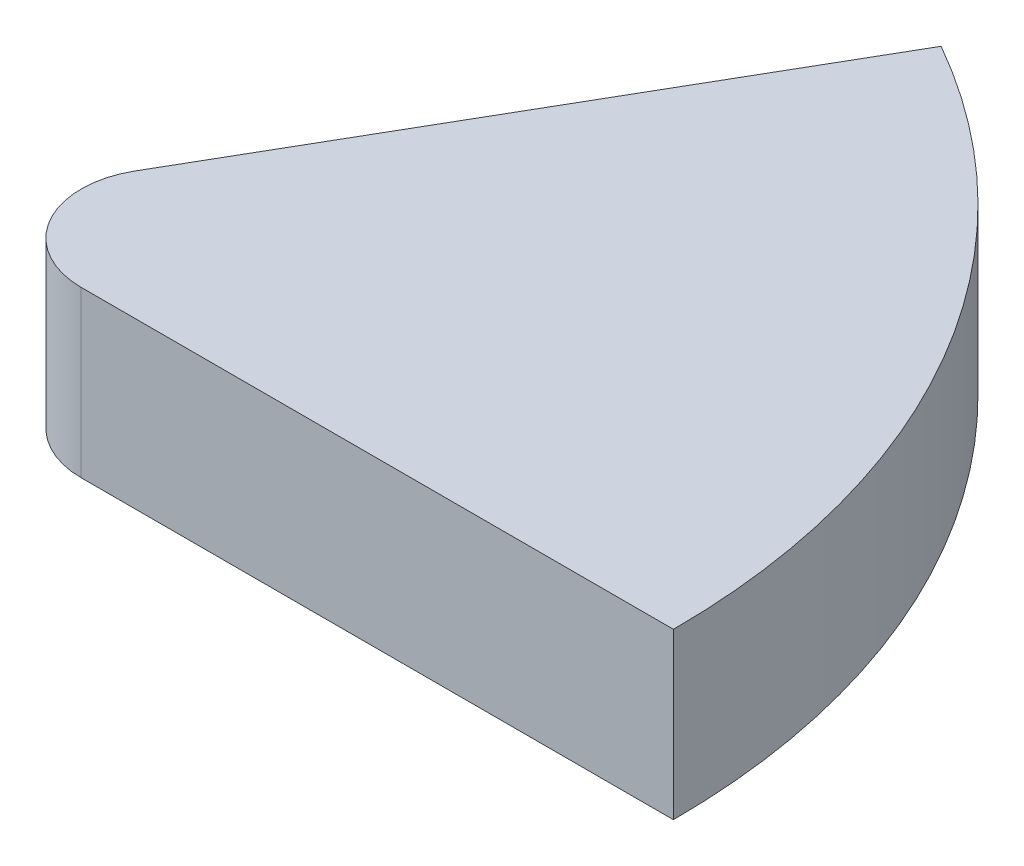
ISO-10303-21;
HEADER;
FILE_DESCRIPTION(('STEP AP214'),'2;1');
FILE_NAME('part.step','',(''),(''),'','','');
FILE_SCHEMA(('AUTOMOTIVE_DESIGN { 1 0 10303 214 1 1 1 1 }'));
ENDSEC;
DATA;
#1=APPLICATION_CONTEXT('core data for automotive mechanical design processes');
#2=APPLICATION_PROTOCOL_DEFINITION('international standard','automotive_design',2000,#1);
#3=PRODUCT_CONTEXT('',#1,'mechanical');
#4=PRODUCT('Part','Part','',(#3));
#5=PRODUCT_RELATED_PRODUCT_CATEGORY('part','',(#4));
#6=PRODUCT_DEFINITION_FORMATION('','',#4);
#7=PRODUCT_DEFINITION_CONTEXT('part definition',#1,'design');
#8=PRODUCT_DEFINITION('design','',#6,#7);
#9=PRODUCT_DEFINITION_SHAPE('','',#8);
#10=(LENGTH_UNIT() NAMED_UNIT(*) SI_UNIT(.MILLI.,.METRE.));
#11=(NAMED_UNIT(*) PLANE_ANGLE_UNIT() SI_UNIT($,.RADIAN.));
#12=(NAMED_UNIT(*) SI_UNIT($,.STERADIAN.) SOLID_ANGLE_UNIT());
#13=UNCERTAINTY_MEASURE_WITH_UNIT(LENGTH_MEASURE(1.E-05),#10,'distance_accuracy_value','');
#14=(GEOMETRIC_REPRESENTATION_CONTEXT(3) GLOBAL_UNCERTAINTY_ASSIGNED_CONTEXT((#13)) GLOBAL_UNIT_ASSIGNED_CONTEXT((#10,
#11,#12)) REPRESENTATION_CONTEXT('',''));
#15=CARTESIAN_POINT('',(0.,0.,0.));
#16=DIRECTION('',(0.,0.,1.));
#17=DIRECTION('',(1.,0.,0.));
#18=AXIS2_PLACEMENT_3D('',#15,#16,#17);
#19=CARTESIAN_POINT('',(-46.840471962274,19.05,5.9910409966335E-11));
#20=DIRECTION('',(0.,-1.,0.));
#21=DIRECTION('',(0.,0.,-1.));
#22=AXIS2_PLACEMENT_3D('',#19,#20,#21);
#23=CYLINDRICAL_SURFACE('',#22,84.940471962274);
#24=CARTESIAN_POINT('',(-46.840471962274,0.,5.9910409966335E-11));
#25=DIRECTION('',(0.,1.,0.));
#26=DIRECTION('',(0.,0.,1.));
#27=AXIS2_PLACEMENT_3D('',#24,#25,#26);
#28=CIRCLE('',#27,84.940471962274);
#29=CARTESIAN_POINT('',(38.1,0.,5.91332538490975E-11));
#30=VERTEX_POINT('',#29);
#31=CARTESIAN_POINT('',(-4.76249999999908,0.,-73.7856900266374));
#32=VERTEX_POINT('',#31);
#33=EDGE_CURVE('E96',#30,#32,#28,.T.);
#34=ORIENTED_EDGE('',*,*,#33,.T.);
#35=DIRECTION('',(0.,-1.,0.));
#36=VECTOR('',#35,1.);
#37=CARTESIAN_POINT('',(-4.76249999999908,19.05,-73.7856900266374));
#38=LINE('',#37,#36);
#39=CARTESIAN_POINT('',(-4.76249999999908,19.05,-73.7856900266374));
#40=VERTEX_POINT('',#39);
#41=EDGE_CURVE('E11',#40,#32,#38,.T.);
#42=ORIENTED_EDGE('',*,*,#41,.F.);
#43=CARTESIAN_POINT('',(-46.840471962274,19.05,5.9910409966335E-11));
#44=DIRECTION('',(0.,1.,0.));
#45=DIRECTION('',(0.,0.,1.));
#46=AXIS2_PLACEMENT_3D('',#43,#44,#45);
#47=CIRCLE('',#46,84.940471962274);
#48=CARTESIAN_POINT('',(38.1,19.05,5.91332538490975E-11));
#49=VERTEX_POINT('',#48);
#50=EDGE_CURVE('E84',#49,#40,#47,.T.);
#51=ORIENTED_EDGE('',*,*,#50,.F.);
#52=DIRECTION('',(0.,-1.,0.));
#53=VECTOR('',#52,1.);
#54=CARTESIAN_POINT('',(38.1,19.05,5.91332538490975E-11));
#55=LINE('',#54,#53);
#56=EDGE_CURVE('E92',#49,#30,#55,.T.);
#57=ORIENTED_EDGE('',*,*,#56,.T.);
#58=EDGE_LOOP('',(#34,#42,#51,#57));
#59=FACE_BOUND('',#58,.T.);
#60=ADVANCED_FACE('F33',(#59),#23,.T.);
#61=CARTESIAN_POINT('',(-4.76249999999908,19.05,-73.7856900266374));
#62=DIRECTION('',(0.866025403784439,0.,0.5));
#63=DIRECTION('',(0.5,0.,-0.866025403784439));
#64=AXIS2_PLACEMENT_3D('',#61,#62,#63);
#65=PLANE('',#64);
#66=DIRECTION('',(-0.5,0.,0.866025403784439));
#67=VECTOR('',#66,1.);
#68=CARTESIAN_POINT('',(-4.76249999999908,0.,-73.7856900266374));
#69=LINE('',#68,#67);
#70=CARTESIAN_POINT('',(-38.8388329625067,0.,-14.7637499999401));
#71=VERTEX_POINT('',#70);
#72=EDGE_CURVE('E88',#32,#71,#69,.T.);
#73=ORIENTED_EDGE('',*,*,#72,.T.);
#74=DIRECTION('',(0.,-1.,0.));
#75=VECTOR('',#74,1.);
#76=CARTESIAN_POINT('',(-38.8388329625067,19.05,-14.7637499999401));
#77=LINE('',#76,#75);
#78=CARTESIAN_POINT('',(-38.8388329625067,19.05,-14.7637499999401));
#79=VERTEX_POINT('',#78);
#80=EDGE_CURVE('E41',#79,#71,#77,.T.);
#81=ORIENTED_EDGE('',*,*,#80,.F.);
#82=DIRECTION('',(-0.5,0.,0.866025403784439));
#83=VECTOR('',#82,1.);
#84=CARTESIAN_POINT('',(-4.76249999999908,19.05,-73.7856900266374));
#85=LINE('',#84,#83);
#86=EDGE_CURVE('E79',#40,#79,#85,.T.);
#87=ORIENTED_EDGE('',*,*,#86,.F.);
#88=ORIENTED_EDGE('',*,*,#41,.T.);
#89=EDGE_LOOP('',(#73,#81,#87,#88));
#90=FACE_BOUND('',#89,.T.);
#91=ADVANCED_FACE('F87',(#90),#65,.F.);
#92=CARTESIAN_POINT('',(-30.3149779257584,19.05,-9.84249999994007));
#93=DIRECTION('',(0.,-1.,0.));
#94=DIRECTION('',(0.,0.,-1.));
#95=AXIS2_PLACEMENT_3D('',#92,#93,#94);
#96=CYLINDRICAL_SURFACE('',#95,9.84249999999999);
#97=CARTESIAN_POINT('',(-30.3149779257584,0.,-9.84249999994007));
#98=DIRECTION('',(0.,1.,0.));
#99=DIRECTION('',(0.,0.,-1.));
#100=AXIS2_PLACEMENT_3D('',#97,#98,#99);
#101=CIRCLE('',#100,9.84249999999999);
#102=CARTESIAN_POINT('',(-30.3149779257584,0.,5.9910409966335E-11));
#103=VERTEX_POINT('',#102);
#104=EDGE_CURVE('E66',#71,#103,#101,.T.);
#105=ORIENTED_EDGE('',*,*,#104,.T.);
#106=DIRECTION('',(0.,-1.,0.));
#107=VECTOR('',#106,1.);
#108=CARTESIAN_POINT('',(-30.3149779257584,19.05,5.9910409966335E-11));
#109=LINE('',#108,#107);
#110=CARTESIAN_POINT('',(-30.3149779257584,19.05,5.9910409966335E-11));
#111=VERTEX_POINT('',#110);
#112=EDGE_CURVE('E89',#111,#103,#109,.T.);
#113=ORIENTED_EDGE('',*,*,#112,.F.);
#114=CARTESIAN_POINT('',(-30.3149779257584,19.05,-9.84249999994007));
#115=DIRECTION('',(0.,1.,0.));
#116=DIRECTION('',(0.,0.,-1.));
#117=AXIS2_PLACEMENT_3D('',#114,#115,#116);
#118=CIRCLE('',#117,9.84249999999999);
#119=EDGE_CURVE('E82',#79,#111,#118,.T.);
#120=ORIENTED_EDGE('',*,*,#119,.F.);
#121=ORIENTED_EDGE('',*,*,#80,.T.);
#122=EDGE_LOOP('',(#105,#113,#120,#121));
#123=FACE_BOUND('',#122,.T.);
#124=ADVANCED_FACE('F90',(#123),#96,.T.);
#125=CARTESIAN_POINT('',(-30.3149779257584,19.05,5.9910409966335E-11));
#126=DIRECTION('',(0.,0.,-1.));
#127=DIRECTION('',(-1.,0.,0.));
#128=AXIS2_PLACEMENT_3D('',#125,#126,#127);
#129=PLANE('',#128);
#130=DIRECTION('',(1.,0.,0.));
#131=VECTOR('',#130,1.);
#132=CARTESIAN_POINT('',(-30.3149779257584,0.,5.9910409966335E-11));
#133=LINE('',#132,#131);
#134=EDGE_CURVE('E72',#103,#30,#133,.T.);
#135=ORIENTED_EDGE('',*,*,#134,.T.);
#136=ORIENTED_EDGE('',*,*,#56,.F.);
#137=DIRECTION('',(1.,0.,0.));
#138=VECTOR('',#137,1.);
#139=CARTESIAN_POINT('',(-30.3149779257584,19.05,5.9910409966335E-11));
#140=LINE('',#139,#138);
#141=EDGE_CURVE('E49',#111,#49,#140,.T.);
#142=ORIENTED_EDGE('',*,*,#141,.F.);
#143=ORIENTED_EDGE('',*,*,#112,.T.);
#144=EDGE_LOOP('',(#135,#136,#142,#143));
#145=FACE_BOUND('',#144,.T.);
#146=ADVANCED_FACE('F103',(#145),#129,.F.);
#147=CARTESIAN_POINT('',(-46.840471962274,19.05,5.9910409966335E-11));
#148=DIRECTION('',(0.,1.,0.));
#149=DIRECTION('',(0.,0.,1.));
#150=AXIS2_PLACEMENT_3D('',#147,#148,#149);
#151=PLANE('',#150);
#152=ORIENTED_EDGE('',*,*,#50,.T.);
#153=ORIENTED_EDGE('',*,*,#86,.T.);
#154=ORIENTED_EDGE('',*,*,#119,.T.);
#155=ORIENTED_EDGE('',*,*,#141,.T.);
#156=EDGE_LOOP('',(#152,#153,#154,#155));
#157=FACE_BOUND('',#156,.T.);
#158=ADVANCED_FACE('F80',(#157),#151,.T.);
#159=CARTESIAN_POINT('',(-46.840471962274,0.,5.9910409966335E-11));
#160=DIRECTION('',(0.,1.,0.));
#161=DIRECTION('',(0.,0.,1.));
#162=AXIS2_PLACEMENT_3D('',#159,#160,#161);
#163=PLANE('',#162);
#164=ORIENTED_EDGE('',*,*,#33,.F.);
#165=ORIENTED_EDGE('',*,*,#134,.F.);
#166=ORIENTED_EDGE('',*,*,#104,.F.);
#167=ORIENTED_EDGE('',*,*,#72,.F.);
#168=EDGE_LOOP('',(#164,#165,#166,#167));
#169=FACE_BOUND('',#168,.T.);
#170=ADVANCED_FACE('F106',(#169),#163,.F.);
#171=CLOSED_SHELL('',(#60,#91,#124,#146,#158,#170));
#172=MANIFOLD_SOLID_BREP('B2',#171);
#173=ADVANCED_BREP_SHAPE_REPRESENTATION('',(#18,#172),#14);
#174=SHAPE_DEFINITION_REPRESENTATION(#9,#173);
ENDSEC;
END-ISO-10303-21;
